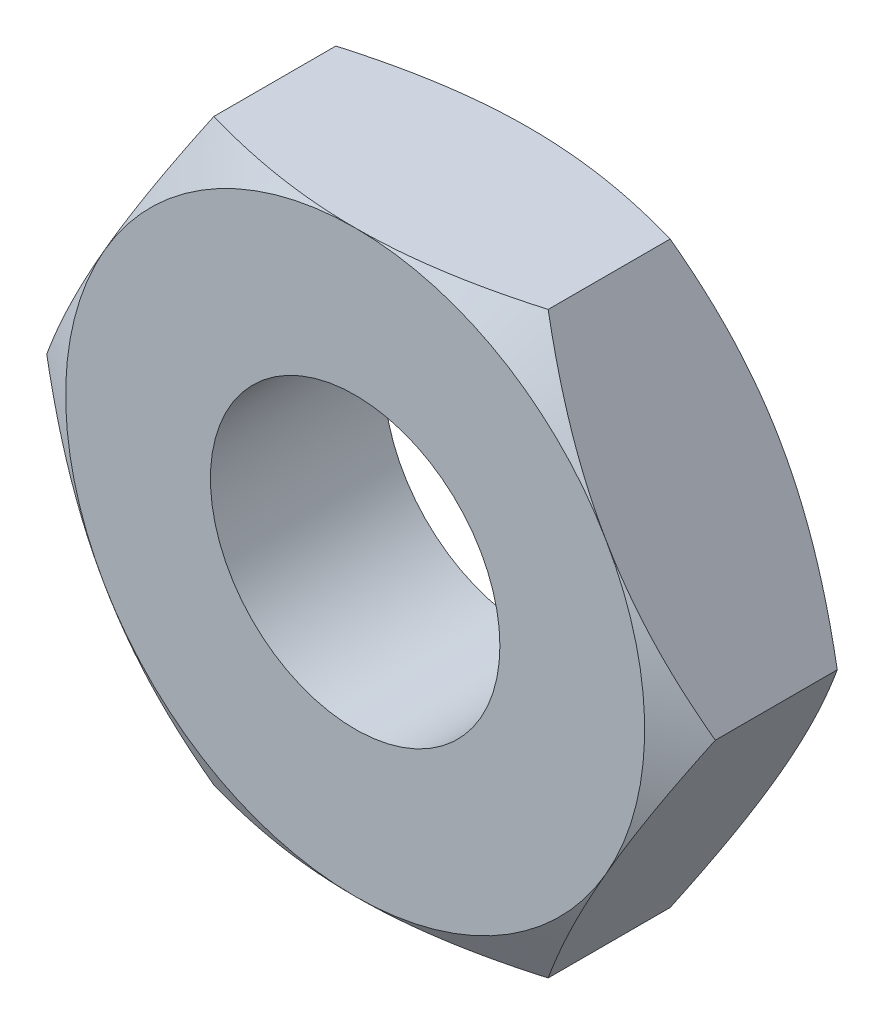
ISO-10303-21;
HEADER;
FILE_DESCRIPTION(('STEP AP214'),'2;1');
FILE_NAME('part.step','',(''),(''),'','','');
FILE_SCHEMA(('AUTOMOTIVE_DESIGN { 1 0 10303 214 1 1 1 1 }'));
ENDSEC;
DATA;
#1=APPLICATION_CONTEXT('core data for automotive mechanical design processes');
#2=APPLICATION_PROTOCOL_DEFINITION('international standard','automotive_design',2000,#1);
#3=PRODUCT_CONTEXT('',#1,'mechanical');
#4=PRODUCT('Part','Part','',(#3));
#5=PRODUCT_RELATED_PRODUCT_CATEGORY('part','',(#4));
#6=PRODUCT_DEFINITION_FORMATION('','',#4);
#7=PRODUCT_DEFINITION_CONTEXT('part definition',#1,'design');
#8=PRODUCT_DEFINITION('design','',#6,#7);
#9=PRODUCT_DEFINITION_SHAPE('','',#8);
#10=(LENGTH_UNIT() NAMED_UNIT(*) SI_UNIT(.MILLI.,.METRE.));
#11=(NAMED_UNIT(*) PLANE_ANGLE_UNIT() SI_UNIT($,.RADIAN.));
#12=(NAMED_UNIT(*) SI_UNIT($,.STERADIAN.) SOLID_ANGLE_UNIT());
#13=UNCERTAINTY_MEASURE_WITH_UNIT(LENGTH_MEASURE(1.E-05),#10,'distance_accuracy_value','');
#14=(GEOMETRIC_REPRESENTATION_CONTEXT(3) GLOBAL_UNCERTAINTY_ASSIGNED_CONTEXT((#13)) GLOBAL_UNIT_ASSIGNED_CONTEXT((#10,
#11,#12)) REPRESENTATION_CONTEXT('',''));
#15=CARTESIAN_POINT('',(0.,0.,0.));
#16=DIRECTION('',(0.,0.,1.));
#17=DIRECTION('',(1.,0.,0.));
#18=AXIS2_PLACEMENT_3D('',#15,#16,#17);
#19=CARTESIAN_POINT('',(2.3094010767585,0.,-1.2));
#20=DIRECTION('',(0.866025403784438,0.5,0.));
#21=DIRECTION('',(-0.5,0.866025403784439,0.));
#22=AXIS2_PLACEMENT_3D('',#19,#20,#21);
#23=PLANE('',#22);
#24=DIRECTION('',(0.,0.,1.));
#25=VECTOR('',#24,1.);
#26=CARTESIAN_POINT('',(2.3094010767585,0.,-1.2));
#27=LINE('',#26,#25);
#28=CARTESIAN_POINT('',(2.3094010767585,0.,-1.02136720504592));
#29=VERTEX_POINT('',#28);
#30=CARTESIAN_POINT('',(2.3094010767585,0.,-0.17863279495408));
#31=VERTEX_POINT('',#30);
#32=EDGE_CURVE('E173',#29,#31,#27,.T.);
#33=ORIENTED_EDGE('',*,*,#32,.F.);
#34=CARTESIAN_POINT('',(2.30951654681234,-0.000199999999999312,-1.0213005333795));
#35=CARTESIAN_POINT('',(2.25877250251758,0.0876912629000608,-1.05061046389932));
#36=CARTESIAN_POINT('',(2.20759044065995,0.176341194473592,-1.07726714801953));
#37=CARTESIAN_POINT('',(2.10433997494456,0.355176246997802,-1.12379750897928));
#38=CARTESIAN_POINT('',(2.0522697359463,0.445364546505037,-1.14365472361722));
#39=CARTESIAN_POINT('',(1.94877459684592,0.624623385763306,-1.17456653597675));
#40=CARTESIAN_POINT('',(1.89736562427197,0.713666338226305,-1.18582684840147));
#41=CARTESIAN_POINT('',(1.79430568008402,0.892171397785044,-1.19927133740536));
#42=CARTESIAN_POINT('',(1.74265508327244,0.981632855703959,-1.20146664504653));
#43=CARTESIAN_POINT('',(1.64613626458981,1.1488083535488,-1.19690901066935));
#44=CARTESIAN_POINT('',(1.60125362236172,1.22654737026578,-1.19127512531299));
#45=CARTESIAN_POINT('',(1.51178075956051,1.38151891453613,-1.17341610473917));
#46=CARTESIAN_POINT('',(1.46719084864821,1.4587509057412,-1.16118486397656));
#47=CARTESIAN_POINT('',(1.37753338590959,1.6140421864822,-1.13060656313239));
#48=CARTESIAN_POINT('',(1.33247718647009,1.69208181310738,-1.11212983293428));
#49=CARTESIAN_POINT('',(1.24303693915875,1.84699686569213,-1.07019448178714));
#50=CARTESIAN_POINT('',(1.1986517446858,1.92387427762312,-1.04674571950769));
#51=CARTESIAN_POINT('',(1.15458506832541,2.0002,-1.0213005333795));
#52=B_SPLINE_CURVE_WITH_KNOTS('',3,(#34,#35,#36,#37,#38,#39,#40,#41,#42,#43,#44,#45,#46,#47,#48,
#49,#50,#51),.UNSPECIFIED.,.F.,.F.,(4,2,2,2,2,2,2,2,4),(0.,0.31703182469561,0.634825876346563,
0.944753967652636,1.25430138000371,1.52387047293094,1.79368946861028,2.06949491027634,
2.34475850821472),.UNSPECIFIED.);
#53=CARTESIAN_POINT('',(1.73205080756888,1.,-1.2));
#54=VERTEX_POINT('',#53);
#55=EDGE_CURVE('E154',#29,#54,#52,.T.);
#56=ORIENTED_EDGE('',*,*,#55,.T.);
#57=CARTESIAN_POINT('',(1.15470053837925,2.,-1.02136720504592));
#58=VERTEX_POINT('',#57);
#59=EDGE_CURVE('E143',#54,#58,#52,.T.);
#60=ORIENTED_EDGE('',*,*,#59,.T.);
#61=DIRECTION('',(0.,0.,1.));
#62=VECTOR('',#61,1.);
#63=CARTESIAN_POINT('',(1.15470053837925,2.,-1.2));
#64=LINE('',#63,#62);
#65=CARTESIAN_POINT('',(1.15470053837925,2.,-0.17863279495408));
#66=VERTEX_POINT('',#65);
#67=EDGE_CURVE('E258',#58,#66,#64,.T.);
#68=ORIENTED_EDGE('',*,*,#67,.T.);
#69=CARTESIAN_POINT('',(1.15458506832541,2.0002,-0.178699466620497));
#70=CARTESIAN_POINT('',(1.20532911262018,1.91230873709994,-0.149389536100678));
#71=CARTESIAN_POINT('',(1.2565111744778,1.82365880552641,-0.122732851980466));
#72=CARTESIAN_POINT('',(1.35976164019319,1.6448237530022,-0.0762024910207205));
#73=CARTESIAN_POINT('',(1.41183187919145,1.55463545349496,-0.0563452763827787));
#74=CARTESIAN_POINT('',(1.51532701829183,1.37537661423669,-0.0254334640232522));
#75=CARTESIAN_POINT('',(1.56673599086578,1.2863336617737,-0.0141731515985309));
#76=CARTESIAN_POINT('',(1.66979593505373,1.10782860221496,-0.000728662594641754));
#77=CARTESIAN_POINT('',(1.72144653186531,1.01836714429604,0.0014666450465319));
#78=CARTESIAN_POINT('',(1.81796535054794,0.851191646451202,-0.00309098933064858));
#79=CARTESIAN_POINT('',(1.86284799277603,0.773452629734217,-0.00872487468701424));
#80=CARTESIAN_POINT('',(1.95232085557725,0.618481085463867,-0.026583895260828));
#81=CARTESIAN_POINT('',(1.99691076648954,0.541249094258802,-0.038815136023439));
#82=CARTESIAN_POINT('',(2.08656822922816,0.3859578135178,-0.0693934368676094));
#83=CARTESIAN_POINT('',(2.13162442866767,0.307918186892621,-0.0878701670657154));
#84=CARTESIAN_POINT('',(2.221064675979,0.153003134307866,-0.129805518212855));
#85=CARTESIAN_POINT('',(2.26544987045196,0.0761257223768809,-0.153254280492313));
#86=CARTESIAN_POINT('',(2.30951654681234,-0.000199999999999199,-0.178699466620497));
#87=B_SPLINE_CURVE_WITH_KNOTS('',3,(#69,#70,#71,#72,#73,#74,#75,#76,#77,#78,#79,#80,#81,#82,#83,
#84,#85,#86),.UNSPECIFIED.,.F.,.F.,(4,2,2,2,2,2,2,2,4),(0.,0.317031824695609,0.634825876346563,
0.944753967652635,1.25430138000371,1.52387047293094,1.79368946861028,2.06949491027634,
2.34475850821472),.UNSPECIFIED.);
#88=CARTESIAN_POINT('',(1.73205080756888,1.,0.));
#89=VERTEX_POINT('',#88);
#90=EDGE_CURVE('E253',#66,#89,#87,.T.);
#91=ORIENTED_EDGE('',*,*,#90,.T.);
#92=EDGE_CURVE('E247',#89,#31,#87,.T.);
#93=ORIENTED_EDGE('',*,*,#92,.T.);
#94=EDGE_LOOP('',(#33,#56,#60,#68,#91,#93));
#95=FACE_BOUND('',#94,.T.);
#96=ADVANCED_FACE('F40',(#95),#23,.T.);
#97=CARTESIAN_POINT('',(1.15470053837925,-2.,-1.2));
#98=DIRECTION('',(0.866025403784439,-0.5,0.));
#99=DIRECTION('',(0.5,0.866025403784439,0.));
#100=AXIS2_PLACEMENT_3D('',#97,#98,#99);
#101=PLANE('',#100);
#102=DIRECTION('',(0.,0.,1.));
#103=VECTOR('',#102,1.);
#104=CARTESIAN_POINT('',(1.15470053837925,-2.,-1.2));
#105=LINE('',#104,#103);
#106=CARTESIAN_POINT('',(1.15470053837925,-2.,-1.02136720504592));
#107=VERTEX_POINT('',#106);
#108=CARTESIAN_POINT('',(1.15470053837925,-2.,-0.17863279495408));
#109=VERTEX_POINT('',#108);
#110=EDGE_CURVE('E265',#107,#109,#105,.T.);
#111=ORIENTED_EDGE('',*,*,#110,.F.);
#112=CARTESIAN_POINT('',(1.15458506832541,-2.0002,-1.0213005333795));
#113=CARTESIAN_POINT('',(1.20532911262018,-1.91230873709994,-1.05061046389932));
#114=CARTESIAN_POINT('',(1.2565111744778,-1.82365880552641,-1.07726714801953));
#115=CARTESIAN_POINT('',(1.35976164019319,-1.6448237530022,-1.12379750897928));
#116=CARTESIAN_POINT('',(1.41183187919145,-1.55463545349496,-1.14365472361722));
#117=CARTESIAN_POINT('',(1.51532701829183,-1.37537661423669,-1.17456653597675));
#118=CARTESIAN_POINT('',(1.56673599086578,-1.2863336617737,-1.18582684840147));
#119=CARTESIAN_POINT('',(1.66979593505373,-1.10782860221496,-1.19927133740536));
#120=CARTESIAN_POINT('',(1.72144653186531,-1.01836714429604,-1.20146664504653));
#121=CARTESIAN_POINT('',(1.81796535054794,-0.851191646451202,-1.19690901066935));
#122=CARTESIAN_POINT('',(1.86284799277603,-0.773452629734217,-1.19127512531299));
#123=CARTESIAN_POINT('',(1.95232085557725,-0.618481085463867,-1.17341610473917));
#124=CARTESIAN_POINT('',(1.99691076648954,-0.541249094258802,-1.16118486397656));
#125=CARTESIAN_POINT('',(2.08656822922816,-0.385957813517799,-1.13060656313239));
#126=CARTESIAN_POINT('',(2.13162442866767,-0.307918186892621,-1.11212983293428));
#127=CARTESIAN_POINT('',(2.221064675979,-0.153003134307865,-1.07019448178714));
#128=CARTESIAN_POINT('',(2.26544987045196,-0.0761257223768795,-1.04674571950769));
#129=CARTESIAN_POINT('',(2.30951654681234,0.000200000000000674,-1.0213005333795));
#130=B_SPLINE_CURVE_WITH_KNOTS('',3,(#112,#113,#114,#115,#116,#117,#118,#119,#120,#121,#122,
#123,#124,#125,#126,#127,#128,#129),.UNSPECIFIED.,.F.,.F.,(4,2,2,2,2,2,2,2,4),(0.,
0.31703182469561,0.634825876346564,0.944753967652636,1.25430138000371,1.52387047293094,
1.79368946861028,2.06949491027634,2.34475850821472),.UNSPECIFIED.);
#131=CARTESIAN_POINT('',(1.73205080756888,-0.999999999999999,-1.2));
#132=VERTEX_POINT('',#131);
#133=EDGE_CURVE('E215',#107,#132,#130,.T.);
#134=ORIENTED_EDGE('',*,*,#133,.T.);
#135=EDGE_CURVE('E160',#132,#29,#130,.T.);
#136=ORIENTED_EDGE('',*,*,#135,.T.);
#137=ORIENTED_EDGE('',*,*,#32,.T.);
#138=CARTESIAN_POINT('',(2.30951654681234,0.000200000000000737,-0.178699466620497));
#139=CARTESIAN_POINT('',(2.25877250251758,-0.0876912629000593,-0.149389536100678));
#140=CARTESIAN_POINT('',(2.20759044065995,-0.176341194473591,-0.122732851980466));
#141=CARTESIAN_POINT('',(2.10433997494456,-0.355176246997801,-0.0762024910207204));
#142=CARTESIAN_POINT('',(2.0522697359463,-0.445364546505036,-0.0563452763827786));
#143=CARTESIAN_POINT('',(1.94877459684592,-0.624623385763305,-0.0254334640232523));
#144=CARTESIAN_POINT('',(1.89736562427197,-0.713666338226303,-0.014173151598531));
#145=CARTESIAN_POINT('',(1.79430568008402,-0.892171397785042,-0.000728662594641788));
#146=CARTESIAN_POINT('',(1.74265508327244,-0.981632855703957,0.00146664504653197));
#147=CARTESIAN_POINT('',(1.64613626458981,-1.1488083535488,-0.00309098933064852));
#148=CARTESIAN_POINT('',(1.60125362236173,-1.22654737026578,-0.00872487468701427));
#149=CARTESIAN_POINT('',(1.51178075956051,-1.38151891453613,-0.026583895260828));
#150=CARTESIAN_POINT('',(1.46719084864821,-1.4587509057412,-0.038815136023439));
#151=CARTESIAN_POINT('',(1.37753338590959,-1.6140421864822,-0.0693934368676094));
#152=CARTESIAN_POINT('',(1.33247718647009,-1.69208181310738,-0.0878701670657155));
#153=CARTESIAN_POINT('',(1.24303693915875,-1.84699686569214,-0.129805518212855));
#154=CARTESIAN_POINT('',(1.1986517446858,-1.92387427762312,-0.153254280492313));
#155=CARTESIAN_POINT('',(1.15458506832541,-2.0002,-0.178699466620497));
#156=B_SPLINE_CURVE_WITH_KNOTS('',3,(#138,#139,#140,#141,#142,#143,#144,#145,#146,#147,#148,
#149,#150,#151,#152,#153,#154,#155),.UNSPECIFIED.,.F.,.F.,(4,2,2,2,2,2,2,2,4),(0.,
0.31703182469561,0.634825876346563,0.944753967652635,1.25430138000371,1.52387047293094,
1.79368946861028,2.06949491027634,2.34475850821472),.UNSPECIFIED.);
#157=CARTESIAN_POINT('',(1.73205080756888,-0.999999999999999,0.));
#158=VERTEX_POINT('',#157);
#159=EDGE_CURVE('E240',#31,#158,#156,.T.);
#160=ORIENTED_EDGE('',*,*,#159,.T.);
#161=EDGE_CURVE('E233',#158,#109,#156,.T.);
#162=ORIENTED_EDGE('',*,*,#161,.T.);
#163=EDGE_LOOP('',(#111,#134,#136,#137,#160,#162));
#164=FACE_BOUND('',#163,.T.);
#165=ADVANCED_FACE('F222',(#164),#101,.T.);
#166=CARTESIAN_POINT('',(-1.15470053837924,-2.,-1.2));
#167=DIRECTION('',(0.,-1.,0.));
#168=DIRECTION('',(1.,0.,0.));
#169=AXIS2_PLACEMENT_3D('',#166,#167,#168);
#170=PLANE('',#169);
#171=DIRECTION('',(0.,0.,1.));
#172=VECTOR('',#171,1.);
#173=CARTESIAN_POINT('',(-1.15470053837924,-2.,-1.2));
#174=LINE('',#173,#172);
#175=CARTESIAN_POINT('',(-1.15470053837925,-2.,-1.02136720504592));
#176=VERTEX_POINT('',#175);
#177=CARTESIAN_POINT('',(-1.15470053837924,-2.,-0.17863279495408));
#178=VERTEX_POINT('',#177);
#179=EDGE_CURVE('E267',#176,#178,#174,.T.);
#180=ORIENTED_EDGE('',*,*,#179,.F.);
#181=CARTESIAN_POINT('',(-3.06243670884926,-2.,-0.242946244298342));
#182=CARTESIAN_POINT('',(-2.97462537456477,-2.,-0.285381534351306));
#183=CARTESIAN_POINT('',(-2.88660642542278,-2.,-0.32739498256197));
#184=CARTESIAN_POINT('',(-2.7100410399043,-2.,-0.410337140450311));
#185=CARTESIAN_POINT('',(-2.62149451540736,-2.,-0.451265662317577));
#186=CARTESIAN_POINT('',(-2.44328340033097,-2.,-0.532012526437257));
#187=CARTESIAN_POINT('',(-2.35361531124171,-2.,-0.571823175245811));
#188=CARTESIAN_POINT('',(-2.17354214087982,-2.,-0.649734508801147));
#189=CARTESIAN_POINT('',(-2.08313709831417,-2.,-0.687835282680518));
#190=CARTESIAN_POINT('',(-1.90031444024273,-2.,-0.762328384320371));
#191=CARTESIAN_POINT('',(-1.80788576524896,-2.,-0.798693718617558));
#192=CARTESIAN_POINT('',(-1.62195726259726,-2.,-0.86856868085399));
#193=CARTESIAN_POINT('',(-1.52845753767457,-2.,-0.902078580127572));
#194=CARTESIAN_POINT('',(-1.34040182163335,-2.,-0.965354047517777));
#195=CARTESIAN_POINT('',(-1.24584841059272,-2.,-0.995127205245311));
#196=CARTESIAN_POINT('',(-1.05539744088343,-2.,-1.04995829551407));
#197=CARTESIAN_POINT('',(-0.959500317628249,-2.,-1.07501771917808));
#198=CARTESIAN_POINT('',(-0.766296162175127,-2.,-1.11920453723145));
#199=CARTESIAN_POINT('',(-0.668988761573955,-2.,-1.13833035125961));
#200=CARTESIAN_POINT('',(-0.473201499243398,-2.,-1.16936309767364));
#201=CARTESIAN_POINT('',(-0.37472163647825,-2.,-1.1812700236818));
#202=CARTESIAN_POINT('',(-0.177725007165872,-2.,-1.19680834640598));
#203=CARTESIAN_POINT('',(-0.0792124969842877,-2.,-1.20049213387509));
#204=CARTESIAN_POINT('',(0.117733470493257,-2.,-1.19940077932984));
#205=CARTESIAN_POINT('',(0.216166941672619,-2.,-1.19462783307904));
#206=CARTESIAN_POINT('',(0.454297669729619,-2.,-1.17327562968436));
#207=CARTESIAN_POINT('',(0.593620948553317,-2.,-1.15251698104436));
#208=CARTESIAN_POINT('',(0.869689823834488,-2.,-1.09780038675936));
#209=CARTESIAN_POINT('',(1.0064321883485,-2.,-1.06382691165978));
#210=CARTESIAN_POINT('',(1.21108764008849,-2.,-1.00524088268493));
#211=CARTESIAN_POINT('',(1.28004713727273,-2.,-0.984142640748009));
#212=CARTESIAN_POINT('',(1.4172425327793,-2.,-0.939857712838904));
#213=CARTESIAN_POINT('',(1.48547889440396,-2.,-0.916672467332592));
#214=CARTESIAN_POINT('',(1.62094752446184,-2.,-0.86869685863592));
#215=CARTESIAN_POINT('',(1.68818328274558,-2.,-0.843916264681625));
#216=CARTESIAN_POINT('',(1.82213314125819,-2.,-0.792900589660032));
#217=CARTESIAN_POINT('',(1.88884701804143,-2.,-0.766664920738091));
#218=CARTESIAN_POINT('',(1.95531919268194,-2.,-0.739845215110288));
#219=B_SPLINE_CURVE_WITH_KNOTS('',3,(#181,#182,#183,#184,#185,#186,#187,#188,#189,#190,#191,
#192,#193,#194,#195,#196,#197,#198,#199,#200,#201,#202,#203,#204,#205,#206,#207,#208,#209,#210,
#211,#212,#213,#214,#215,#216,#217,#218),.UNSPECIFIED.,.F.,.F.,(4,2,2,2,2,2,2,2,2,2,2,2,2,2,2,2,
2,2,4),(0.,0.292585981547725,0.585222285876962,0.879533230089779,1.17382881455956,
1.47176815658413,1.76967915563007,2.06697493039128,2.36417650111644,2.66145716086699,
2.95873808325712,3.2541195157486,3.54942426464478,3.9711430779806,4.39335898038569,
4.60967797518337,4.82584879332086,5.04080285667119,5.25584440381786),.UNSPECIFIED.);
#220=CARTESIAN_POINT('',(0.,-2.,-1.2));
#221=VERTEX_POINT('',#220);
#222=EDGE_CURVE('E360',#176,#221,#219,.T.);
#223=ORIENTED_EDGE('',*,*,#222,.T.);
#224=EDGE_CURVE('E216',#221,#107,#219,.T.);
#225=ORIENTED_EDGE('',*,*,#224,.T.);
#226=ORIENTED_EDGE('',*,*,#110,.T.);
#227=CARTESIAN_POINT('',(-3.06243670884926,-2.,-0.957053755701653));
#228=CARTESIAN_POINT('',(-2.97462537456477,-2.,-0.91461846564869));
#229=CARTESIAN_POINT('',(-2.88660642542278,-2.,-0.872605017438026));
#230=CARTESIAN_POINT('',(-2.7100410399043,-2.,-0.789662859549685));
#231=CARTESIAN_POINT('',(-2.62149451540736,-2.,-0.74873433768242));
#232=CARTESIAN_POINT('',(-2.44328340033097,-2.,-0.66798747356274));
#233=CARTESIAN_POINT('',(-2.35361531124171,-2.,-0.628176824754186));
#234=CARTESIAN_POINT('',(-2.17354214087982,-2.,-0.55026549119885));
#235=CARTESIAN_POINT('',(-2.08313709831417,-2.,-0.51216471731948));
#236=CARTESIAN_POINT('',(-1.90031444024273,-2.,-0.437671615679627));
#237=CARTESIAN_POINT('',(-1.80788576524895,-2.,-0.40130628138244));
#238=CARTESIAN_POINT('',(-1.62195726259725,-2.,-0.331431319146008));
#239=CARTESIAN_POINT('',(-1.52845753767457,-2.,-0.297921419872426));
#240=CARTESIAN_POINT('',(-1.34040182163335,-2.,-0.234645952482221));
#241=CARTESIAN_POINT('',(-1.24584841059272,-2.,-0.204872794754688));
#242=CARTESIAN_POINT('',(-1.05539744088343,-2.,-0.150041704485925));
#243=CARTESIAN_POINT('',(-0.959500317628249,-2.,-0.124982280821916));
#244=CARTESIAN_POINT('',(-0.766296162175126,-2.,-0.0807954627685529));
#245=CARTESIAN_POINT('',(-0.668988761573955,-2.,-0.0616696487403929));
#246=CARTESIAN_POINT('',(-0.473201499243398,-2.,-0.0306369023263644));
#247=CARTESIAN_POINT('',(-0.37472163647825,-2.,-0.0187299763182013));
#248=CARTESIAN_POINT('',(-0.177725007165873,-2.,-0.00319165359402001));
#249=CARTESIAN_POINT('',(-0.079212496984288,-2.,0.000492133875092076));
#250=CARTESIAN_POINT('',(0.117733470493257,-2.,-0.000599220670161883));
#251=CARTESIAN_POINT('',(0.216166941672618,-2.,-0.00537216692095547));
#252=CARTESIAN_POINT('',(0.454297669729619,-2.,-0.0267243703156365));
#253=CARTESIAN_POINT('',(0.593620948553316,-2.,-0.0474830189556355));
#254=CARTESIAN_POINT('',(0.86968982383449,-2.,-0.102199613240639));
#255=CARTESIAN_POINT('',(1.0064321883485,-2.,-0.136173088340221));
#256=CARTESIAN_POINT('',(1.21108764008849,-2.,-0.194759117315066));
#257=CARTESIAN_POINT('',(1.28004713727273,-2.,-0.215857359251991));
#258=CARTESIAN_POINT('',(1.41724253277931,-2.,-0.260142287161096));
#259=CARTESIAN_POINT('',(1.48547889440396,-2.,-0.283327532667408));
#260=CARTESIAN_POINT('',(1.62094752446184,-2.,-0.33130314136408));
#261=CARTESIAN_POINT('',(1.68818328274558,-2.,-0.356083735318376));
#262=CARTESIAN_POINT('',(1.8221331412582,-2.,-0.407099410339969));
#263=CARTESIAN_POINT('',(1.88884701804143,-2.,-0.433335079261909));
#264=CARTESIAN_POINT('',(1.95531919268194,-2.,-0.460154784889712));
#265=B_SPLINE_CURVE_WITH_KNOTS('',3,(#227,#228,#229,#230,#231,#232,#233,#234,#235,#236,#237,
#238,#239,#240,#241,#242,#243,#244,#245,#246,#247,#248,#249,#250,#251,#252,#253,#254,#255,#256,
#257,#258,#259,#260,#261,#262,#263,#264),.UNSPECIFIED.,.F.,.F.,(4,2,2,2,2,2,2,2,2,2,2,2,2,2,2,2,
2,2,4),(0.,0.292585981547725,0.585222285876962,0.879533230089778,1.17382881455956,
1.47176815658413,1.76967915563007,2.06697493039128,2.36417650111644,2.66145716086699,
2.95873808325711,3.2541195157486,3.54942426464477,3.9711430779806,4.39335898038569,
4.60967797518337,4.82584879332087,5.04080285667119,5.25584440381786),.UNSPECIFIED.);
#266=CARTESIAN_POINT('',(0.,-2.,0.));
#267=VERTEX_POINT('',#266);
#268=EDGE_CURVE('E241',#109,#267,#265,.F.);
#269=ORIENTED_EDGE('',*,*,#268,.T.);
#270=EDGE_CURVE('E242',#267,#178,#265,.F.);
#271=ORIENTED_EDGE('',*,*,#270,.T.);
#272=EDGE_LOOP('',(#180,#223,#225,#226,#269,#271));
#273=FACE_BOUND('',#272,.T.);
#274=ADVANCED_FACE('F226',(#273),#170,.T.);
#275=CARTESIAN_POINT('',(-2.3094010767585,0.,-1.2));
#276=DIRECTION('',(-0.866025403784438,-0.500000000000001,0.));
#277=DIRECTION('',(0.500000000000001,-0.866025403784438,0.));
#278=AXIS2_PLACEMENT_3D('',#275,#276,#277);
#279=PLANE('',#278);
#280=DIRECTION('',(0.,0.,1.));
#281=VECTOR('',#280,1.);
#282=CARTESIAN_POINT('',(-2.3094010767585,0.,-1.2));
#283=LINE('',#282,#281);
#284=CARTESIAN_POINT('',(-2.3094010767585,0.,-1.02136720504592));
#285=VERTEX_POINT('',#284);
#286=CARTESIAN_POINT('',(-2.3094010767585,0.,-0.17863279495408));
#287=VERTEX_POINT('',#286);
#288=EDGE_CURVE('E270',#285,#287,#283,.T.);
#289=ORIENTED_EDGE('',*,*,#288,.F.);
#290=CARTESIAN_POINT('',(-2.30951654681234,0.00019999999999843,-1.0213005333795));
#291=CARTESIAN_POINT('',(-2.25877250251757,-0.0876912629000613,-1.05061046389932));
#292=CARTESIAN_POINT('',(-2.20759044065995,-0.176341194473593,-1.07726714801954));
#293=CARTESIAN_POINT('',(-2.10433997494456,-0.355176246997803,-1.12379750897928));
#294=CARTESIAN_POINT('',(-2.0522697359463,-0.445364546505037,-1.14365472361722));
#295=CARTESIAN_POINT('',(-1.94877459684592,-0.624623385763306,-1.17456653597675));
#296=CARTESIAN_POINT('',(-1.89736562427197,-0.713666338226304,-1.18582684840147));
#297=CARTESIAN_POINT('',(-1.79430568008402,-0.892171397785042,-1.19927133740536));
#298=CARTESIAN_POINT('',(-1.74265508327244,-0.981632855703957,-1.20146664504653));
#299=CARTESIAN_POINT('',(-1.64613626458981,-1.1488083535488,-1.19690901066935));
#300=CARTESIAN_POINT('',(-1.60125362236172,-1.22654737026578,-1.19127512531299));
#301=CARTESIAN_POINT('',(-1.5117807595605,-1.38151891453613,-1.17341610473917));
#302=CARTESIAN_POINT('',(-1.46719084864821,-1.4587509057412,-1.16118486397656));
#303=CARTESIAN_POINT('',(-1.37753338590959,-1.6140421864822,-1.13060656313239));
#304=CARTESIAN_POINT('',(-1.33247718647008,-1.69208181310738,-1.11212983293429));
#305=CARTESIAN_POINT('',(-1.24303693915875,-1.84699686569214,-1.07019448178715));
#306=CARTESIAN_POINT('',(-1.19865174468579,-1.92387427762312,-1.04674571950769));
#307=CARTESIAN_POINT('',(-1.15458506832541,-2.0002,-1.0213005333795));
#308=B_SPLINE_CURVE_WITH_KNOTS('',3,(#290,#291,#292,#293,#294,#295,#296,#297,#298,#299,#300,
#301,#302,#303,#304,#305,#306,#307),.UNSPECIFIED.,.F.,.F.,(4,2,2,2,2,2,2,2,4),(0.,
0.317031824695609,0.634825876346562,0.944753967652634,1.25430138000371,1.52387047293094,
1.79368946861028,2.06949491027634,2.34475850821473),.UNSPECIFIED.);
#309=CARTESIAN_POINT('',(-1.73205080756888,-1.,-1.2));
#310=VERTEX_POINT('',#309);
#311=EDGE_CURVE('E177',#285,#310,#308,.T.);
#312=ORIENTED_EDGE('',*,*,#311,.T.);
#313=EDGE_CURVE('E367',#310,#176,#308,.T.);
#314=ORIENTED_EDGE('',*,*,#313,.T.);
#315=ORIENTED_EDGE('',*,*,#179,.T.);
#316=CARTESIAN_POINT('',(-1.15458506832541,-2.0002,-0.178699466620496));
#317=CARTESIAN_POINT('',(-1.20532911262017,-1.91230873709994,-0.149389536100677));
#318=CARTESIAN_POINT('',(-1.25651117447779,-1.82365880552641,-0.122732851980465));
#319=CARTESIAN_POINT('',(-1.35976164019319,-1.6448237530022,-0.0762024910207194));
#320=CARTESIAN_POINT('',(-1.41183187919144,-1.55463545349497,-0.0563452763827774));
#321=CARTESIAN_POINT('',(-1.51532701829182,-1.3753766142367,-0.0254334640232507));
#322=CARTESIAN_POINT('',(-1.56673599086578,-1.2863336617737,-0.0141731515985293));
#323=CARTESIAN_POINT('',(-1.66979593505372,-1.10782860221496,-0.000728662594639881));
#324=CARTESIAN_POINT('',(-1.72144653186531,-1.01836714429605,0.00146664504653401));
#325=CARTESIAN_POINT('',(-1.81796535054793,-0.851191646451206,-0.00309098933064626));
#326=CARTESIAN_POINT('',(-1.86284799277602,-0.77345262973422,-0.00872487468701195));
#327=CARTESIAN_POINT('',(-1.95232085557724,-0.61848108546387,-0.0265838952608255));
#328=CARTESIAN_POINT('',(-1.99691076648954,-0.541249094258805,-0.0388151360234364));
#329=CARTESIAN_POINT('',(-2.08656822922816,-0.385957813517802,-0.0693934368676067));
#330=CARTESIAN_POINT('',(-2.13162442866766,-0.307918186892623,-0.0878701670657127));
#331=CARTESIAN_POINT('',(-2.221064675979,-0.153003134307867,-0.129805518212853));
#332=CARTESIAN_POINT('',(-2.26544987045195,-0.0761257223768817,-0.15325428049231));
#333=CARTESIAN_POINT('',(-2.30951654681234,0.000199999999998705,-0.178699466620495));
#334=B_SPLINE_CURVE_WITH_KNOTS('',3,(#316,#317,#318,#319,#320,#321,#322,#323,#324,#325,#326,
#327,#328,#329,#330,#331,#332,#333),.UNSPECIFIED.,.F.,.F.,(4,2,2,2,2,2,2,2,4),(0.,
0.31703182469561,0.634825876346563,0.944753967652634,1.25430138000371,1.52387047293094,
1.79368946861028,2.06949491027634,2.34475850821473),.UNSPECIFIED.);
#335=CARTESIAN_POINT('',(-1.73205080756888,-1.,0.));
#336=VERTEX_POINT('',#335);
#337=EDGE_CURVE('E321',#178,#336,#334,.T.);
#338=ORIENTED_EDGE('',*,*,#337,.T.);
#339=EDGE_CURVE('E323',#336,#287,#334,.T.);
#340=ORIENTED_EDGE('',*,*,#339,.T.);
#341=EDGE_LOOP('',(#289,#312,#314,#315,#338,#340));
#342=FACE_BOUND('',#341,.T.);
#343=ADVANCED_FACE('F337',(#342),#279,.T.);
#344=CARTESIAN_POINT('',(-1.15470053837925,2.,-1.2));
#345=DIRECTION('',(-0.866025403784439,0.499999999999999,0.));
#346=DIRECTION('',(-0.5,-0.866025403784439,0.));
#347=AXIS2_PLACEMENT_3D('',#344,#345,#346);
#348=PLANE('',#347);
#349=DIRECTION('',(0.,0.,1.));
#350=VECTOR('',#349,1.);
#351=CARTESIAN_POINT('',(-1.15470053837925,2.,-1.2));
#352=LINE('',#351,#350);
#353=CARTESIAN_POINT('',(-1.15470053837925,2.,-1.02136720504592));
#354=VERTEX_POINT('',#353);
#355=CARTESIAN_POINT('',(-1.15470053837925,2.,-0.17863279495408));
#356=VERTEX_POINT('',#355);
#357=EDGE_CURVE('E273',#354,#356,#352,.T.);
#358=ORIENTED_EDGE('',*,*,#357,.F.);
#359=CARTESIAN_POINT('',(-1.15458506832541,2.0002,-1.0213005333795));
#360=CARTESIAN_POINT('',(-1.20532911262018,1.91230873709994,-1.05061046389932));
#361=CARTESIAN_POINT('',(-1.2565111744778,1.82365880552641,-1.07726714801953));
#362=CARTESIAN_POINT('',(-1.35976164019319,1.6448237530022,-1.12379750897928));
#363=CARTESIAN_POINT('',(-1.41183187919145,1.55463545349496,-1.14365472361722));
#364=CARTESIAN_POINT('',(-1.51532701829183,1.37537661423669,-1.17456653597675));
#365=CARTESIAN_POINT('',(-1.56673599086578,1.2863336617737,-1.18582684840147));
#366=CARTESIAN_POINT('',(-1.66979593505373,1.10782860221496,-1.19927133740536));
#367=CARTESIAN_POINT('',(-1.72144653186531,1.01836714429604,-1.20146664504653));
#368=CARTESIAN_POINT('',(-1.81796535054794,0.851191646451202,-1.19690901066935));
#369=CARTESIAN_POINT('',(-1.86284799277602,0.773452629734216,-1.19127512531299));
#370=CARTESIAN_POINT('',(-1.95232085557724,0.618481085463866,-1.17341610473917));
#371=CARTESIAN_POINT('',(-1.99691076648954,0.541249094258801,-1.16118486397656));
#372=CARTESIAN_POINT('',(-2.08656822922816,0.385957813517799,-1.13060656313239));
#373=CARTESIAN_POINT('',(-2.13162442866766,0.30791818689262,-1.11212983293429));
#374=CARTESIAN_POINT('',(-2.221064675979,0.153003134307864,-1.07019448178715));
#375=CARTESIAN_POINT('',(-2.26544987045195,0.0761257223768789,-1.04674571950769));
#376=CARTESIAN_POINT('',(-2.30951654681234,-0.000200000000001487,-1.0213005333795));
#377=B_SPLINE_CURVE_WITH_KNOTS('',3,(#359,#360,#361,#362,#363,#364,#365,#366,#367,#368,#369,
#370,#371,#372,#373,#374,#375,#376),.UNSPECIFIED.,.F.,.F.,(4,2,2,2,2,2,2,2,4),(0.,
0.31703182469561,0.634825876346563,0.944753967652635,1.25430138000371,1.52387047293094,
1.79368946861028,2.06949491027634,2.34475850821472),.UNSPECIFIED.);
#378=CARTESIAN_POINT('',(-1.73205080756888,0.999999999999999,-1.2));
#379=VERTEX_POINT('',#378);
#380=EDGE_CURVE('E64',#354,#379,#377,.T.);
#381=ORIENTED_EDGE('',*,*,#380,.T.);
#382=EDGE_CURVE('E174',#379,#285,#377,.T.);
#383=ORIENTED_EDGE('',*,*,#382,.T.);
#384=ORIENTED_EDGE('',*,*,#288,.T.);
#385=CARTESIAN_POINT('',(-2.30951654681234,-0.000200000000001596,-0.178699466620494));
#386=CARTESIAN_POINT('',(-2.25877250251757,0.0876912629000585,-0.149389536100676));
#387=CARTESIAN_POINT('',(-2.20759044065995,0.17634119447359,-0.122732851980464));
#388=CARTESIAN_POINT('',(-2.10433997494456,0.3551762469978,-0.0762024910207184));
#389=CARTESIAN_POINT('',(-2.0522697359463,0.445364546505034,-0.0563452763827766));
#390=CARTESIAN_POINT('',(-1.94877459684592,0.624623385763303,-0.0254334640232503));
#391=CARTESIAN_POINT('',(-1.89736562427197,0.713666338226301,-0.014173151598529));
#392=CARTESIAN_POINT('',(-1.79430568008402,0.89217139778504,-0.000728662594639785));
#393=CARTESIAN_POINT('',(-1.74265508327244,0.981632855703955,0.00146664504653397));
#394=CARTESIAN_POINT('',(-1.64613626458981,1.14880835354879,-0.00309098933064657));
#395=CARTESIAN_POINT('',(-1.60125362236172,1.22654737026578,-0.00872487468701237));
#396=CARTESIAN_POINT('',(-1.5117807595605,1.38151891453613,-0.0265838952608262));
#397=CARTESIAN_POINT('',(-1.46719084864821,1.4587509057412,-0.0388151360234372));
#398=CARTESIAN_POINT('',(-1.37753338590959,1.6140421864822,-0.0693934368676076));
#399=CARTESIAN_POINT('',(-1.33247718647008,1.69208181310738,-0.0878701670657137));
#400=CARTESIAN_POINT('',(-1.24303693915875,1.84699686569213,-0.129805518212853));
#401=CARTESIAN_POINT('',(-1.19865174468579,1.92387427762312,-0.153254280492311));
#402=CARTESIAN_POINT('',(-1.15458506832541,2.0002,-0.178699466620495));
#403=B_SPLINE_CURVE_WITH_KNOTS('',3,(#385,#386,#387,#388,#389,#390,#391,#392,#393,#394,#395,
#396,#397,#398,#399,#400,#401,#402),.UNSPECIFIED.,.F.,.F.,(4,2,2,2,2,2,2,2,4),(0.,
0.317031824695609,0.634825876346562,0.944753967652633,1.25430138000371,1.52387047293093,
1.79368946861028,2.06949491027634,2.34475850821472),.UNSPECIFIED.);
#404=CARTESIAN_POINT('',(-1.73205080756888,0.999999999999999,0.));
#405=VERTEX_POINT('',#404);
#406=EDGE_CURVE('E327',#287,#405,#403,.T.);
#407=ORIENTED_EDGE('',*,*,#406,.T.);
#408=EDGE_CURVE('E332',#405,#356,#403,.T.);
#409=ORIENTED_EDGE('',*,*,#408,.T.);
#410=EDGE_LOOP('',(#358,#381,#383,#384,#407,#409));
#411=FACE_BOUND('',#410,.T.);
#412=ADVANCED_FACE('F340',(#411),#348,.T.);
#413=CARTESIAN_POINT('',(1.15470053837925,2.,-1.2));
#414=DIRECTION('',(0.,1.,0.));
#415=DIRECTION('',(-1.,0.,0.));
#416=AXIS2_PLACEMENT_3D('',#413,#414,#415);
#417=PLANE('',#416);
#418=ORIENTED_EDGE('',*,*,#67,.F.);
#419=CARTESIAN_POINT('',(-3.06243599497945,2.,-0.242946589379688));
#420=CARTESIAN_POINT('',(-2.97462468513201,2.,-0.285381864667557));
#421=CARTESIAN_POINT('',(-2.88660576044574,2.,-0.32739529812181));
#422=CARTESIAN_POINT('',(-2.71004042392046,2.,-0.410337426575919));
#423=CARTESIAN_POINT('',(-2.62149392396102,2.,-0.451265933765375));
#424=CARTESIAN_POINT('',(-2.44328285836993,2.,-0.532012768522036));
#425=CARTESIAN_POINT('',(-2.35361479423019,2.,-0.571823402648507));
#426=CARTESIAN_POINT('',(-2.17354167395291,2.,-0.649734707109847));
#427=CARTESIAN_POINT('',(-2.08313665652234,2.,-0.687835466577275));
#428=CARTESIAN_POINT('',(-1.90031404940484,2.,-0.762328539637907));
#429=CARTESIAN_POINT('',(-1.80788540023433,2.,-0.798693859775677));
#430=CARTESIAN_POINT('',(-1.6219569496476,2.,-0.86856879448493));
#431=CARTESIAN_POINT('',(-1.52845725096657,2.,-0.902078680390602));
#432=CARTESIAN_POINT('',(-1.34040158791133,2.,-0.96535412237286));
#433=CARTESIAN_POINT('',(-1.24584820361333,2.,-0.995127268056317));
#434=CARTESIAN_POINT('',(-1.05539728812542,2.,-1.0499583362749));
#435=CARTESIAN_POINT('',(-0.959500192348558,2.,-1.07501774993149));
#436=CARTESIAN_POINT('',(-0.766296107056171,2.,-1.11920454773855));
#437=CARTESIAN_POINT('',(-0.668988749343048,2.,-1.13833035240976));
#438=CARTESIAN_POINT('',(-0.473201573751656,2.,-1.16936308665098));
#439=CARTESIAN_POINT('',(-0.374721754836863,2.,-1.18127000983859));
#440=CARTESIAN_POINT('',(-0.177725213014454,2.,-1.19680833464032));
#441=CARTESIAN_POINT('',(-0.0792127464695911,2.,-1.20049212694298));
#442=CARTESIAN_POINT('',(0.117733134481548,2.,-1.19940078951715));
#443=CARTESIAN_POINT('',(0.216166562771046,2.,-1.19462785555389));
#444=CARTESIAN_POINT('',(0.454297223248128,2.,-1.17327568608797));
#445=CARTESIAN_POINT('',(0.593620477818544,2.,-1.15251705811094));
#446=CARTESIAN_POINT('',(0.869689306254779,2.,-1.09780050572932));
#447=CARTESIAN_POINT('',(1.00643164818022,2.,-1.06382705187579));
#448=CARTESIAN_POINT('',(1.21108706615396,2.,-1.00524105434464));
#449=CARTESIAN_POINT('',(1.28004655189502,2.,-0.984142822967432));
#450=CARTESIAN_POINT('',(1.41724192464573,2.,-0.939857915871669));
#451=CARTESIAN_POINT('',(1.4854782749575,2.,-0.916672680618839));
#452=CARTESIAN_POINT('',(1.62094688255355,2.,-0.868697092028027));
#453=CARTESIAN_POINT('',(1.68818262968756,2.,-0.843916507926394));
#454=CARTESIAN_POINT('',(1.82213246587636,2.,-0.79290085231338));
#455=CARTESIAN_POINT('',(1.88884633148567,2.,-0.766665192947669));
#456=CARTESIAN_POINT('',(1.95531849493344,2.,-0.739845496729099));
#457=B_SPLINE_CURVE_WITH_KNOTS('',3,(#419,#420,#421,#422,#423,#424,#425,#426,#427,#428,#429,
#430,#431,#432,#433,#434,#435,#436,#437,#438,#439,#440,#441,#442,#443,#444,#445,#446,#447,#448,
#449,#450,#451,#452,#453,#454,#455,#456),.UNSPECIFIED.,.F.,.F.,(4,2,2,2,2,2,2,2,2,2,2,2,2,2,2,2,
2,2,4),(0.,0.292585896266134,0.585222115299632,0.879532973229947,1.17382847142413,
1.47176772581358,1.76967863724006,2.06697432467462,2.36417580814397,2.66145633652584,
2.95873712774068,3.2541184304568,3.54942304948605,3.97114178181683,4.39335760296179,
4.60967655565109,4.82584733174413,5.0408013534775,5.25584285892499),.UNSPECIFIED.);
#458=CARTESIAN_POINT('',(0.,2.,-1.2));
#459=VERTEX_POINT('',#458);
#460=EDGE_CURVE('E149',#58,#459,#457,.F.);
#461=ORIENTED_EDGE('',*,*,#460,.T.);
#462=EDGE_CURVE('E169',#459,#354,#457,.F.);
#463=ORIENTED_EDGE('',*,*,#462,.T.);
#464=ORIENTED_EDGE('',*,*,#357,.T.);
#465=CARTESIAN_POINT('',(-3.06243599497945,2.,-0.957053410620308));
#466=CARTESIAN_POINT('',(-2.97462468513201,2.,-0.914618135332439));
#467=CARTESIAN_POINT('',(-2.88660576044574,2.,-0.872604701878186));
#468=CARTESIAN_POINT('',(-2.71004042392046,2.,-0.789662573424077));
#469=CARTESIAN_POINT('',(-2.62149392396102,2.,-0.748734066234622));
#470=CARTESIAN_POINT('',(-2.44328285836993,2.,-0.667987231477962));
#471=CARTESIAN_POINT('',(-2.35361479423019,2.,-0.628176597351491));
#472=CARTESIAN_POINT('',(-2.17354167395291,2.,-0.550265292890151));
#473=CARTESIAN_POINT('',(-2.08313665652234,2.,-0.512164533422723));
#474=CARTESIAN_POINT('',(-1.90031404940484,2.,-0.437671460362091));
#475=CARTESIAN_POINT('',(-1.80788540023433,2.,-0.401306140224321));
#476=CARTESIAN_POINT('',(-1.6219569496476,2.,-0.331431205515069));
#477=CARTESIAN_POINT('',(-1.52845725096657,2.,-0.297921319609396));
#478=CARTESIAN_POINT('',(-1.34040158791133,2.,-0.234645877627138));
#479=CARTESIAN_POINT('',(-1.24584820361333,2.,-0.204872731943681));
#480=CARTESIAN_POINT('',(-1.05539728812542,2.,-0.150041663725094));
#481=CARTESIAN_POINT('',(-0.959500192348558,2.,-0.124982250068509));
#482=CARTESIAN_POINT('',(-0.766296107056171,2.,-0.0807954522614493));
#483=CARTESIAN_POINT('',(-0.668988749343048,2.,-0.0616696475902371));
#484=CARTESIAN_POINT('',(-0.473201573751656,2.,-0.0306369133490202));
#485=CARTESIAN_POINT('',(-0.374721754836863,2.,-0.0187299901614141));
#486=CARTESIAN_POINT('',(-0.177725213014454,2.,-0.00319166535968431));
#487=CARTESIAN_POINT('',(-0.0792127464695911,2.,0.00049212694297915));
#488=CARTESIAN_POINT('',(0.117733134481548,2.,-0.000599210482845366));
#489=CARTESIAN_POINT('',(0.216166562771046,2.,-0.00537214444610993));
#490=CARTESIAN_POINT('',(0.454297223248128,2.,-0.0267243139120264));
#491=CARTESIAN_POINT('',(0.593620477818545,2.,-0.0474829418890647));
#492=CARTESIAN_POINT('',(0.869689306254782,2.,-0.10219949427068));
#493=CARTESIAN_POINT('',(1.00643164818023,2.,-0.136172948124205));
#494=CARTESIAN_POINT('',(1.21108706615396,2.,-0.194758945655364));
#495=CARTESIAN_POINT('',(1.28004655189503,2.,-0.215857177032568));
#496=CARTESIAN_POINT('',(1.41724192464573,2.,-0.260142084128331));
#497=CARTESIAN_POINT('',(1.4854782749575,2.,-0.283327319381161));
#498=CARTESIAN_POINT('',(1.62094688255355,2.,-0.331302907971974));
#499=CARTESIAN_POINT('',(1.68818262968757,2.,-0.356083492073607));
#500=CARTESIAN_POINT('',(1.82213246587637,2.,-0.407099147686621));
#501=CARTESIAN_POINT('',(1.88884633148568,2.,-0.433334807052332));
#502=CARTESIAN_POINT('',(1.95531849493345,2.,-0.460154503270902));
#503=B_SPLINE_CURVE_WITH_KNOTS('',3,(#465,#466,#467,#468,#469,#470,#471,#472,#473,#474,#475,
#476,#477,#478,#479,#480,#481,#482,#483,#484,#485,#486,#487,#488,#489,#490,#491,#492,#493,#494,
#495,#496,#497,#498,#499,#500,#501,#502),.UNSPECIFIED.,.F.,.F.,(4,2,2,2,2,2,2,2,2,2,2,2,2,2,2,2,
2,2,4),(0.,0.292585896266135,0.585222115299633,0.879532973229947,1.17382847142413,
1.47176772581358,1.76967863724007,2.06697432467462,2.36417580814397,2.66145633652584,
2.95873712774068,3.2541184304568,3.54942304948605,3.97114178181684,4.39335760296179,
4.60967655565109,4.82584733174414,5.0408013534775,5.255842858925),.UNSPECIFIED.);
#504=CARTESIAN_POINT('',(0.,2.,0.));
#505=VERTEX_POINT('',#504);
#506=EDGE_CURVE('E357',#356,#505,#503,.T.);
#507=ORIENTED_EDGE('',*,*,#506,.T.);
#508=EDGE_CURVE('E351',#505,#66,#503,.T.);
#509=ORIENTED_EDGE('',*,*,#508,.T.);
#510=EDGE_LOOP('',(#418,#461,#463,#464,#507,#509));
#511=FACE_BOUND('',#510,.T.);
#512=ADVANCED_FACE('F344',(#511),#417,.T.);
#513=CARTESIAN_POINT('',(3.46410161513775,-2.,-1.2));
#514=DIRECTION('',(0.,0.,-1.));
#515=DIRECTION('',(-1.,0.,0.));
#516=AXIS2_PLACEMENT_3D('',#513,#514,#515);
#517=PLANE('',#516);
#518=CARTESIAN_POINT('',(0.,0.,-1.2));
#519=DIRECTION('',(0.,0.,1.));
#520=DIRECTION('',(1.,0.,0.));
#521=AXIS2_PLACEMENT_3D('',#518,#519,#520);
#522=CIRCLE('',#521,1.);
#523=CARTESIAN_POINT('',(1.,0.,-1.2));
#524=VERTEX_POINT('',#523);
#525=EDGE_CURVE('E254',#524,#524,#522,.T.);
#526=ORIENTED_EDGE('',*,*,#525,.T.);
#527=EDGE_LOOP('',(#526));
#528=FACE_BOUND('',#527,.T.);
#529=CARTESIAN_POINT('',(0.,0.,-1.2));
#530=DIRECTION('',(0.,0.,-1.));
#531=DIRECTION('',(-1.,0.,0.));
#532=AXIS2_PLACEMENT_3D('',#529,#530,#531);
#533=CIRCLE('',#532,2.);
#534=EDGE_CURVE('E44',#310,#379,#533,.T.);
#535=ORIENTED_EDGE('',*,*,#534,.T.);
#536=EDGE_CURVE('E11',#379,#459,#533,.T.);
#537=ORIENTED_EDGE('',*,*,#536,.T.);
#538=CARTESIAN_POINT('',(0.,0.,-1.2));
#539=DIRECTION('',(0.,0.,1.));
#540=DIRECTION('',(1.,0.,0.));
#541=AXIS2_PLACEMENT_3D('',#538,#539,#540);
#542=CIRCLE('',#541,2.);
#543=EDGE_CURVE('E147',#54,#459,#542,.T.);
#544=ORIENTED_EDGE('',*,*,#543,.F.);
#545=EDGE_CURVE('E50',#54,#132,#533,.T.);
#546=ORIENTED_EDGE('',*,*,#545,.T.);
#547=EDGE_CURVE('E165',#132,#221,#533,.T.);
#548=ORIENTED_EDGE('',*,*,#547,.T.);
#549=EDGE_CURVE('E298',#221,#310,#533,.T.);
#550=ORIENTED_EDGE('',*,*,#549,.T.);
#551=EDGE_LOOP('',(#535,#537,#544,#546,#548,#550));
#552=FACE_BOUND('',#551,.T.);
#553=ADVANCED_FACE('F167',(#528,#552),#517,.T.);
#554=CARTESIAN_POINT('',(3.46410161513775,-2.,0.));
#555=DIRECTION('',(0.,0.,-1.));
#556=DIRECTION('',(-1.,0.,0.));
#557=AXIS2_PLACEMENT_3D('',#554,#555,#556);
#558=PLANE('',#557);
#559=CARTESIAN_POINT('',(0.,0.,0.));
#560=DIRECTION('',(0.,0.,1.));
#561=DIRECTION('',(1.,0.,0.));
#562=AXIS2_PLACEMENT_3D('',#559,#560,#561);
#563=CIRCLE('',#562,1.);
#564=CARTESIAN_POINT('',(1.,0.,0.));
#565=VERTEX_POINT('',#564);
#566=EDGE_CURVE('E259',#565,#565,#563,.T.);
#567=ORIENTED_EDGE('',*,*,#566,.F.);
#568=EDGE_LOOP('',(#567));
#569=FACE_BOUND('',#568,.T.);
#570=CARTESIAN_POINT('',(0.,0.,0.));
#571=DIRECTION('',(0.,0.,-1.));
#572=DIRECTION('',(-1.,0.,0.));
#573=AXIS2_PLACEMENT_3D('',#570,#571,#572);
#574=CIRCLE('',#573,2.);
#575=EDGE_CURVE('E280',#405,#505,#574,.T.);
#576=ORIENTED_EDGE('',*,*,#575,.F.);
#577=EDGE_CURVE('E264',#336,#405,#574,.T.);
#578=ORIENTED_EDGE('',*,*,#577,.F.);
#579=EDGE_CURVE('E279',#267,#336,#574,.T.);
#580=ORIENTED_EDGE('',*,*,#579,.F.);
#581=EDGE_CURVE('E288',#158,#267,#574,.T.);
#582=ORIENTED_EDGE('',*,*,#581,.F.);
#583=EDGE_CURVE('E291',#89,#158,#574,.T.);
#584=ORIENTED_EDGE('',*,*,#583,.F.);
#585=CARTESIAN_POINT('',(0.,0.,0.));
#586=DIRECTION('',(0.,0.,1.));
#587=DIRECTION('',(1.,0.,0.));
#588=AXIS2_PLACEMENT_3D('',#585,#586,#587);
#589=CIRCLE('',#588,2.);
#590=EDGE_CURVE('E358',#89,#505,#589,.T.);
#591=ORIENTED_EDGE('',*,*,#590,.T.);
#592=EDGE_LOOP('',(#576,#578,#580,#582,#584,#591));
#593=FACE_BOUND('',#592,.T.);
#594=ADVANCED_FACE('F228',(#569,#593),#558,.F.);
#595=CARTESIAN_POINT('',(0.,0.,-1.2));
#596=DIRECTION('',(0.,0.,1.));
#597=DIRECTION('',(1.,0.,0.));
#598=AXIS2_PLACEMENT_3D('',#595,#596,#597);
#599=CYLINDRICAL_SURFACE('',#598,1.);
#600=ORIENTED_EDGE('',*,*,#525,.F.);
#601=EDGE_LOOP('',(#600));
#602=FACE_BOUND('',#601,.T.);
#603=ORIENTED_EDGE('',*,*,#566,.T.);
#604=EDGE_LOOP('',(#603));
#605=FACE_BOUND('',#604,.T.);
#606=ADVANCED_FACE('F387',(#602,#605),#599,.F.);
#607=CARTESIAN_POINT('',(0.,0.,0.));
#608=DIRECTION('',(0.,0.,-1.));
#609=DIRECTION('',(-1.,0.,0.));
#610=AXIS2_PLACEMENT_3D('',#607,#608,#609);
#611=CONICAL_SURFACE('',#610,2.,1.0471975511966);
#612=ORIENTED_EDGE('',*,*,#577,.T.);
#613=ORIENTED_EDGE('',*,*,#406,.F.);
#614=ORIENTED_EDGE('',*,*,#339,.F.);
#615=EDGE_LOOP('',(#612,#613,#614));
#616=FACE_BOUND('',#615,.T.);
#617=ADVANCED_FACE('F384',(#616),#611,.T.);
#618=ORIENTED_EDGE('',*,*,#579,.T.);
#619=ORIENTED_EDGE('',*,*,#337,.F.);
#620=ORIENTED_EDGE('',*,*,#270,.F.);
#621=EDGE_LOOP('',(#618,#619,#620));
#622=FACE_BOUND('',#621,.T.);
#623=ADVANCED_FACE('F386',(#622),#611,.T.);
#624=ORIENTED_EDGE('',*,*,#581,.T.);
#625=ORIENTED_EDGE('',*,*,#268,.F.);
#626=ORIENTED_EDGE('',*,*,#161,.F.);
#627=EDGE_LOOP('',(#624,#625,#626));
#628=FACE_BOUND('',#627,.T.);
#629=ADVANCED_FACE('F309',(#628),#611,.T.);
#630=ORIENTED_EDGE('',*,*,#583,.T.);
#631=ORIENTED_EDGE('',*,*,#159,.F.);
#632=ORIENTED_EDGE('',*,*,#92,.F.);
#633=EDGE_LOOP('',(#630,#631,#632));
#634=FACE_BOUND('',#633,.T.);
#635=ADVANCED_FACE('F487',(#634),#611,.T.);
#636=ORIENTED_EDGE('',*,*,#508,.F.);
#637=ORIENTED_EDGE('',*,*,#590,.F.);
#638=ORIENTED_EDGE('',*,*,#90,.F.);
#639=EDGE_LOOP('',(#636,#637,#638));
#640=FACE_BOUND('',#639,.T.);
#641=ADVANCED_FACE('F394',(#640),#611,.T.);
#642=ORIENTED_EDGE('',*,*,#575,.T.);
#643=ORIENTED_EDGE('',*,*,#506,.F.);
#644=ORIENTED_EDGE('',*,*,#408,.F.);
#645=EDGE_LOOP('',(#642,#643,#644));
#646=FACE_BOUND('',#645,.T.);
#647=ADVANCED_FACE('F199',(#646),#611,.T.);
#648=CARTESIAN_POINT('',(0.,0.,-1.02136720504592));
#649=DIRECTION('',(0.,0.,1.));
#650=DIRECTION('',(1.,0.,0.));
#651=AXIS2_PLACEMENT_3D('',#648,#649,#650);
#652=CONICAL_SURFACE('',#651,2.3094010767585,1.0471975511966);
#653=ORIENTED_EDGE('',*,*,#382,.F.);
#654=ORIENTED_EDGE('',*,*,#534,.F.);
#655=ORIENTED_EDGE('',*,*,#311,.F.);
#656=EDGE_LOOP('',(#653,#654,#655));
#657=FACE_BOUND('',#656,.T.);
#658=ADVANCED_FACE('F376',(#657),#652,.T.);
#659=ORIENTED_EDGE('',*,*,#313,.F.);
#660=ORIENTED_EDGE('',*,*,#549,.F.);
#661=ORIENTED_EDGE('',*,*,#222,.F.);
#662=EDGE_LOOP('',(#659,#660,#661));
#663=FACE_BOUND('',#662,.T.);
#664=ADVANCED_FACE('F198',(#663),#652,.T.);
#665=ORIENTED_EDGE('',*,*,#547,.F.);
#666=ORIENTED_EDGE('',*,*,#133,.F.);
#667=ORIENTED_EDGE('',*,*,#224,.F.);
#668=EDGE_LOOP('',(#665,#666,#667));
#669=FACE_BOUND('',#668,.T.);
#670=ADVANCED_FACE('F523',(#669),#652,.T.);
#671=ORIENTED_EDGE('',*,*,#545,.F.);
#672=ORIENTED_EDGE('',*,*,#55,.F.);
#673=ORIENTED_EDGE('',*,*,#135,.F.);
#674=EDGE_LOOP('',(#671,#672,#673));
#675=FACE_BOUND('',#674,.T.);
#676=ADVANCED_FACE('F158',(#675),#652,.T.);
#677=ORIENTED_EDGE('',*,*,#543,.T.);
#678=ORIENTED_EDGE('',*,*,#460,.F.);
#679=ORIENTED_EDGE('',*,*,#59,.F.);
#680=EDGE_LOOP('',(#677,#678,#679));
#681=FACE_BOUND('',#680,.T.);
#682=ADVANCED_FACE('F145',(#681),#652,.T.);
#683=ORIENTED_EDGE('',*,*,#462,.F.);
#684=ORIENTED_EDGE('',*,*,#536,.F.);
#685=ORIENTED_EDGE('',*,*,#380,.F.);
#686=EDGE_LOOP('',(#683,#684,#685));
#687=FACE_BOUND('',#686,.T.);
#688=ADVANCED_FACE('F194',(#687),#652,.T.);
#689=CLOSED_SHELL('',(#96,#165,#274,#343,#412,#512,#553,#594,#606,#617,#623,#629,#635,#641,#647,
#658,#664,#670,#676,#682,#688));
#690=MANIFOLD_SOLID_BREP('B2',#689);
#691=ADVANCED_BREP_SHAPE_REPRESENTATION('',(#18,#690),#14);
#692=SHAPE_DEFINITION_REPRESENTATION(#9,#691);
ENDSEC;
END-ISO-10303-21;
